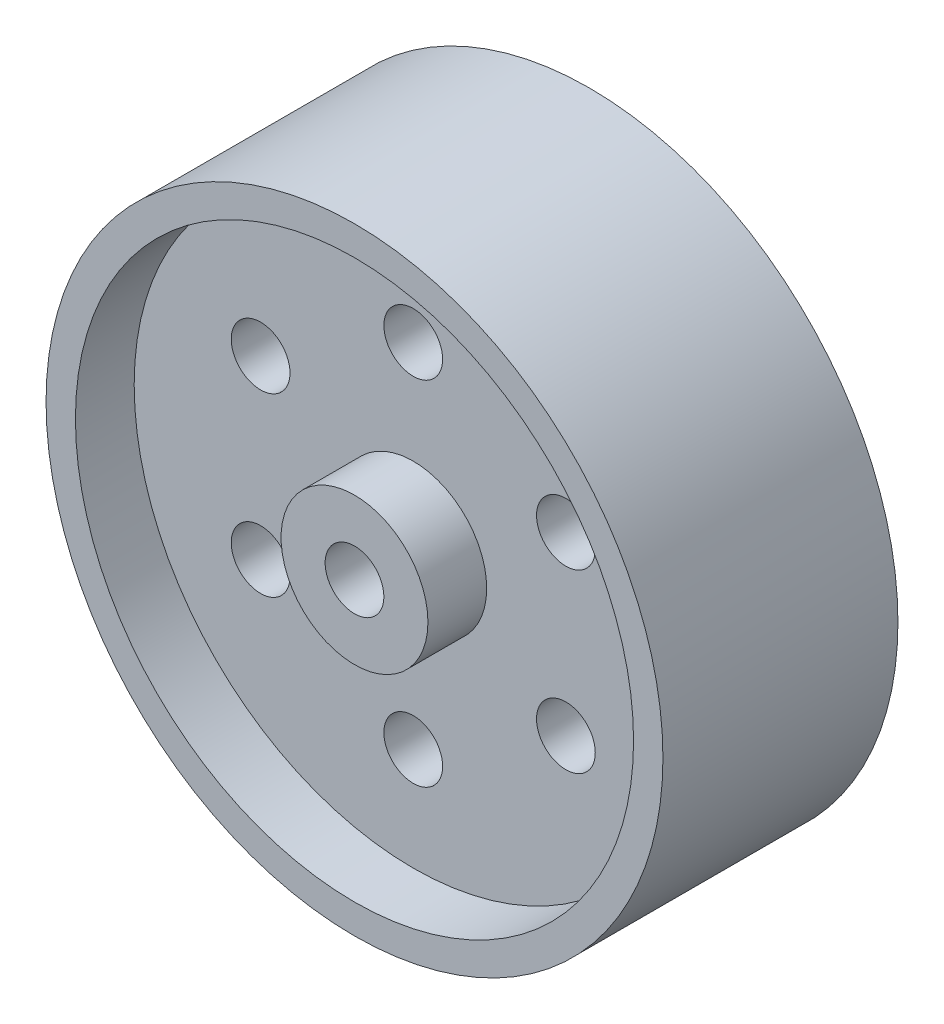
ISO-10303-21;
HEADER;
FILE_DESCRIPTION(('STEP AP214'),'2;1');
FILE_NAME('part.step','',(''),(''),'','','');
FILE_SCHEMA(('AUTOMOTIVE_DESIGN { 1 0 10303 214 1 1 1 1 }'));
ENDSEC;
DATA;
#1=APPLICATION_CONTEXT('core data for automotive mechanical design processes');
#2=APPLICATION_PROTOCOL_DEFINITION('international standard','automotive_design',2000,#1);
#3=PRODUCT_CONTEXT('',#1,'mechanical');
#4=PRODUCT('Part','Part','',(#3));
#5=PRODUCT_RELATED_PRODUCT_CATEGORY('part','',(#4));
#6=PRODUCT_DEFINITION_FORMATION('','',#4);
#7=PRODUCT_DEFINITION_CONTEXT('part definition',#1,'design');
#8=PRODUCT_DEFINITION('design','',#6,#7);
#9=PRODUCT_DEFINITION_SHAPE('','',#8);
#10=(LENGTH_UNIT() NAMED_UNIT(*) SI_UNIT(.MILLI.,.METRE.));
#11=(NAMED_UNIT(*) PLANE_ANGLE_UNIT() SI_UNIT($,.RADIAN.));
#12=(NAMED_UNIT(*) SI_UNIT($,.STERADIAN.) SOLID_ANGLE_UNIT());
#13=UNCERTAINTY_MEASURE_WITH_UNIT(LENGTH_MEASURE(1.E-05),#10,'distance_accuracy_value','');
#14=(GEOMETRIC_REPRESENTATION_CONTEXT(3) GLOBAL_UNCERTAINTY_ASSIGNED_CONTEXT((#13)) GLOBAL_UNIT_ASSIGNED_CONTEXT((#10,
#11,#12)) REPRESENTATION_CONTEXT('',''));
#15=CARTESIAN_POINT('',(0.,0.,0.));
#16=DIRECTION('',(0.,0.,1.));
#17=DIRECTION('',(1.,0.,0.));
#18=AXIS2_PLACEMENT_3D('',#15,#16,#17);
#19=CARTESIAN_POINT('',(0.,0.,-8.));
#20=DIRECTION('',(0.,0.,1.));
#21=DIRECTION('',(1.,0.,0.));
#22=AXIS2_PLACEMENT_3D('',#19,#20,#21);
#23=PLANE('',#22);
#24=CARTESIAN_POINT('',(0.,12.,-8.));
#25=DIRECTION('',(0.,0.,1.));
#26=DIRECTION('',(1.,0.,0.));
#27=AXIS2_PLACEMENT_3D('',#24,#25,#26);
#28=CIRCLE('',#27,2.);
#29=CARTESIAN_POINT('',(2.,12.,-8.));
#30=VERTEX_POINT('',#29);
#31=EDGE_CURVE('E45',#30,#30,#28,.T.);
#32=ORIENTED_EDGE('',*,*,#31,.T.);
#33=EDGE_LOOP('',(#32));
#34=FACE_BOUND('',#33,.T.);
#35=CARTESIAN_POINT('',(10.3923048454133,5.99999999999998,-8.));
#36=DIRECTION('',(0.,0.,1.));
#37=DIRECTION('',(1.,0.,0.));
#38=AXIS2_PLACEMENT_3D('',#35,#36,#37);
#39=CIRCLE('',#38,2.);
#40=CARTESIAN_POINT('',(12.3923048454133,5.99999999999998,-8.));
#41=VERTEX_POINT('',#40);
#42=EDGE_CURVE('E70',#41,#41,#39,.T.);
#43=ORIENTED_EDGE('',*,*,#42,.T.);
#44=EDGE_LOOP('',(#43));
#45=FACE_BOUND('',#44,.T.);
#46=CARTESIAN_POINT('',(10.3923048454133,-6.,-8.));
#47=DIRECTION('',(0.,0.,1.));
#48=DIRECTION('',(1.,0.,0.));
#49=AXIS2_PLACEMENT_3D('',#46,#47,#48);
#50=CIRCLE('',#49,2.00000000000006);
#51=CARTESIAN_POINT('',(12.3923048454133,-6.,-8.));
#52=VERTEX_POINT('',#51);
#53=EDGE_CURVE('E67',#52,#52,#50,.T.);
#54=ORIENTED_EDGE('',*,*,#53,.T.);
#55=EDGE_LOOP('',(#54));
#56=FACE_BOUND('',#55,.T.);
#57=CARTESIAN_POINT('',(0.,-12.,-8.));
#58=DIRECTION('',(0.,0.,1.));
#59=DIRECTION('',(1.,0.,0.));
#60=AXIS2_PLACEMENT_3D('',#57,#58,#59);
#61=CIRCLE('',#60,2.00000000000008);
#62=CARTESIAN_POINT('',(2.00000000000008,-12.,-8.));
#63=VERTEX_POINT('',#62);
#64=EDGE_CURVE('E64',#63,#63,#61,.T.);
#65=ORIENTED_EDGE('',*,*,#64,.T.);
#66=EDGE_LOOP('',(#65));
#67=FACE_BOUND('',#66,.T.);
#68=CARTESIAN_POINT('',(-10.3923048454133,-6.00000000000001,-8.));
#69=DIRECTION('',(0.,0.,1.));
#70=DIRECTION('',(1.,0.,0.));
#71=AXIS2_PLACEMENT_3D('',#68,#69,#70);
#72=CIRCLE('',#71,2.00000000000011);
#73=CARTESIAN_POINT('',(-8.39230484541315,-6.00000000000001,-8.));
#74=VERTEX_POINT('',#73);
#75=EDGE_CURVE('E60',#74,#74,#72,.T.);
#76=ORIENTED_EDGE('',*,*,#75,.T.);
#77=EDGE_LOOP('',(#76));
#78=FACE_BOUND('',#77,.T.);
#79=CARTESIAN_POINT('',(-10.3923048454129,5.99999999999941,-8.));
#80=DIRECTION('',(0.,0.,1.));
#81=DIRECTION('',(1.,0.,0.));
#82=AXIS2_PLACEMENT_3D('',#79,#80,#81);
#83=CIRCLE('',#82,2.00000000000064);
#84=CARTESIAN_POINT('',(-8.39230484541229,5.99999999999941,-8.));
#85=VERTEX_POINT('',#84);
#86=EDGE_CURVE('E57',#85,#85,#83,.T.);
#87=ORIENTED_EDGE('',*,*,#86,.T.);
#88=EDGE_LOOP('',(#87));
#89=FACE_BOUND('',#88,.T.);
#90=CARTESIAN_POINT('',(0.,0.,-8.));
#91=DIRECTION('',(0.,0.,1.));
#92=DIRECTION('',(1.,0.,0.));
#93=AXIS2_PLACEMENT_3D('',#90,#91,#92);
#94=CIRCLE('',#93,15.);
#95=CARTESIAN_POINT('',(15.,0.,-8.));
#96=VERTEX_POINT('',#95);
#97=EDGE_CURVE('E10',#96,#96,#94,.T.);
#98=ORIENTED_EDGE('',*,*,#97,.F.);
#99=EDGE_LOOP('',(#98));
#100=FACE_BOUND('',#99,.T.);
#101=CARTESIAN_POINT('',(0.,0.,-8.));
#102=DIRECTION('',(0.,0.,1.));
#103=DIRECTION('',(1.,0.,0.));
#104=AXIS2_PLACEMENT_3D('',#101,#102,#103);
#105=CIRCLE('',#104,2.);
#106=CARTESIAN_POINT('',(2.,0.,-8.));
#107=VERTEX_POINT('',#106);
#108=EDGE_CURVE('E156',#107,#107,#105,.F.);
#109=ORIENTED_EDGE('',*,*,#108,.F.);
#110=EDGE_LOOP('',(#109));
#111=FACE_BOUND('',#110,.T.);
#112=ADVANCED_FACE('F33',(#34,#45,#56,#67,#78,#89,#100,#111),#23,.F.);
#113=CARTESIAN_POINT('',(0.,12.,-8.));
#114=DIRECTION('',(0.,0.,1.));
#115=DIRECTION('',(1.,0.,0.));
#116=AXIS2_PLACEMENT_3D('',#113,#114,#115);
#117=CYLINDRICAL_SURFACE('',#116,2.);
#118=ORIENTED_EDGE('',*,*,#31,.F.);
#119=EDGE_LOOP('',(#118));
#120=FACE_BOUND('',#119,.T.);
#121=CARTESIAN_POINT('',(0.,12.,0.));
#122=DIRECTION('',(0.,0.,1.));
#123=DIRECTION('',(1.,0.,0.));
#124=AXIS2_PLACEMENT_3D('',#121,#122,#123);
#125=CIRCLE('',#124,2.);
#126=CARTESIAN_POINT('',(2.,12.,0.));
#127=VERTEX_POINT('',#126);
#128=EDGE_CURVE('E61',#127,#127,#125,.T.);
#129=ORIENTED_EDGE('',*,*,#128,.T.);
#130=EDGE_LOOP('',(#129));
#131=FACE_BOUND('',#130,.T.);
#132=ADVANCED_FACE('F91',(#120,#131),#117,.F.);
#133=CARTESIAN_POINT('',(10.3923048454133,5.99999999999998,-8.));
#134=DIRECTION('',(0.,0.,1.));
#135=DIRECTION('',(1.,0.,0.));
#136=AXIS2_PLACEMENT_3D('',#133,#134,#135);
#137=CYLINDRICAL_SURFACE('',#136,2.);
#138=ORIENTED_EDGE('',*,*,#42,.F.);
#139=EDGE_LOOP('',(#138));
#140=FACE_BOUND('',#139,.T.);
#141=CARTESIAN_POINT('',(10.3923048454133,5.99999999999998,0.));
#142=DIRECTION('',(0.,0.,1.));
#143=DIRECTION('',(1.,0.,0.));
#144=AXIS2_PLACEMENT_3D('',#141,#142,#143);
#145=CIRCLE('',#144,2.);
#146=CARTESIAN_POINT('',(12.3923048454133,5.99999999999998,0.));
#147=VERTEX_POINT('',#146);
#148=EDGE_CURVE('E86',#147,#147,#145,.T.);
#149=ORIENTED_EDGE('',*,*,#148,.T.);
#150=EDGE_LOOP('',(#149));
#151=FACE_BOUND('',#150,.T.);
#152=ADVANCED_FACE('F128',(#140,#151),#137,.F.);
#153=CARTESIAN_POINT('',(10.3923048454133,-6.,-8.));
#154=DIRECTION('',(0.,0.,1.));
#155=DIRECTION('',(1.,0.,0.));
#156=AXIS2_PLACEMENT_3D('',#153,#154,#155);
#157=CYLINDRICAL_SURFACE('',#156,2.00000000000006);
#158=ORIENTED_EDGE('',*,*,#53,.F.);
#159=EDGE_LOOP('',(#158));
#160=FACE_BOUND('',#159,.T.);
#161=CARTESIAN_POINT('',(10.3923048454133,-6.,0.));
#162=DIRECTION('',(0.,0.,1.));
#163=DIRECTION('',(1.,0.,0.));
#164=AXIS2_PLACEMENT_3D('',#161,#162,#163);
#165=CIRCLE('',#164,2.00000000000006);
#166=CARTESIAN_POINT('',(12.3923048454133,-6.,0.));
#167=VERTEX_POINT('',#166);
#168=EDGE_CURVE('E83',#167,#167,#165,.T.);
#169=ORIENTED_EDGE('',*,*,#168,.T.);
#170=EDGE_LOOP('',(#169));
#171=FACE_BOUND('',#170,.T.);
#172=ADVANCED_FACE('F137',(#160,#171),#157,.F.);
#173=CARTESIAN_POINT('',(0.,-12.,-8.));
#174=DIRECTION('',(0.,0.,1.));
#175=DIRECTION('',(1.,0.,0.));
#176=AXIS2_PLACEMENT_3D('',#173,#174,#175);
#177=CYLINDRICAL_SURFACE('',#176,2.00000000000008);
#178=ORIENTED_EDGE('',*,*,#64,.F.);
#179=EDGE_LOOP('',(#178));
#180=FACE_BOUND('',#179,.T.);
#181=CARTESIAN_POINT('',(0.,-12.,0.));
#182=DIRECTION('',(0.,0.,1.));
#183=DIRECTION('',(1.,0.,0.));
#184=AXIS2_PLACEMENT_3D('',#181,#182,#183);
#185=CIRCLE('',#184,2.00000000000008);
#186=CARTESIAN_POINT('',(2.00000000000008,-12.,0.));
#187=VERTEX_POINT('',#186);
#188=EDGE_CURVE('E80',#187,#187,#185,.T.);
#189=ORIENTED_EDGE('',*,*,#188,.T.);
#190=EDGE_LOOP('',(#189));
#191=FACE_BOUND('',#190,.T.);
#192=ADVANCED_FACE('F118',(#180,#191),#177,.F.);
#193=CARTESIAN_POINT('',(-10.3923048454133,-6.00000000000001,-8.));
#194=DIRECTION('',(0.,0.,1.));
#195=DIRECTION('',(1.,0.,0.));
#196=AXIS2_PLACEMENT_3D('',#193,#194,#195);
#197=CYLINDRICAL_SURFACE('',#196,2.00000000000011);
#198=ORIENTED_EDGE('',*,*,#75,.F.);
#199=EDGE_LOOP('',(#198));
#200=FACE_BOUND('',#199,.T.);
#201=CARTESIAN_POINT('',(-10.3923048454133,-6.00000000000001,0.));
#202=DIRECTION('',(0.,0.,1.));
#203=DIRECTION('',(1.,0.,0.));
#204=AXIS2_PLACEMENT_3D('',#201,#202,#203);
#205=CIRCLE('',#204,2.00000000000011);
#206=CARTESIAN_POINT('',(-8.39230484541315,-6.00000000000001,0.));
#207=VERTEX_POINT('',#206);
#208=EDGE_CURVE('E77',#207,#207,#205,.T.);
#209=ORIENTED_EDGE('',*,*,#208,.T.);
#210=EDGE_LOOP('',(#209));
#211=FACE_BOUND('',#210,.T.);
#212=ADVANCED_FACE('F111',(#200,#211),#197,.F.);
#213=CARTESIAN_POINT('',(-10.3923048454129,5.99999999999941,-8.));
#214=DIRECTION('',(0.,0.,1.));
#215=DIRECTION('',(1.,0.,0.));
#216=AXIS2_PLACEMENT_3D('',#213,#214,#215);
#217=CYLINDRICAL_SURFACE('',#216,2.00000000000064);
#218=ORIENTED_EDGE('',*,*,#86,.F.);
#219=EDGE_LOOP('',(#218));
#220=FACE_BOUND('',#219,.T.);
#221=CARTESIAN_POINT('',(-10.3923048454129,5.99999999999941,0.));
#222=DIRECTION('',(0.,0.,1.));
#223=DIRECTION('',(1.,0.,0.));
#224=AXIS2_PLACEMENT_3D('',#221,#222,#223);
#225=CIRCLE('',#224,2.00000000000064);
#226=CARTESIAN_POINT('',(-8.39230484541229,5.99999999999941,0.));
#227=VERTEX_POINT('',#226);
#228=EDGE_CURVE('E56',#227,#227,#225,.T.);
#229=ORIENTED_EDGE('',*,*,#228,.T.);
#230=EDGE_LOOP('',(#229));
#231=FACE_BOUND('',#230,.T.);
#232=ADVANCED_FACE('F109',(#220,#231),#217,.F.);
#233=CARTESIAN_POINT('',(0.,0.,-8.));
#234=DIRECTION('',(0.,0.,1.));
#235=DIRECTION('',(1.,0.,0.));
#236=AXIS2_PLACEMENT_3D('',#233,#234,#235);
#237=CYLINDRICAL_SURFACE('',#236,21.);
#238=CARTESIAN_POINT('',(0.,0.,4.));
#239=DIRECTION('',(0.,0.,1.));
#240=DIRECTION('',(1.,0.,0.));
#241=AXIS2_PLACEMENT_3D('',#238,#239,#240);
#242=CIRCLE('',#241,21.);
#243=CARTESIAN_POINT('',(21.,0.,4.));
#244=VERTEX_POINT('',#243);
#245=EDGE_CURVE('E53',#244,#244,#242,.T.);
#246=ORIENTED_EDGE('',*,*,#245,.F.);
#247=EDGE_LOOP('',(#246));
#248=FACE_BOUND('',#247,.T.);
#249=CARTESIAN_POINT('',(0.,0.,-12.));
#250=DIRECTION('',(0.,0.,1.));
#251=DIRECTION('',(1.,0.,0.));
#252=AXIS2_PLACEMENT_3D('',#249,#250,#251);
#253=CIRCLE('',#252,21.);
#254=CARTESIAN_POINT('',(21.,0.,-12.));
#255=VERTEX_POINT('',#254);
#256=EDGE_CURVE('E158',#255,#255,#253,.T.);
#257=ORIENTED_EDGE('',*,*,#256,.T.);
#258=EDGE_LOOP('',(#257));
#259=FACE_BOUND('',#258,.T.);
#260=ADVANCED_FACE('F35',(#248,#259),#237,.T.);
#261=CARTESIAN_POINT('',(0.,0.,0.));
#262=DIRECTION('',(0.,0.,1.));
#263=DIRECTION('',(1.,0.,0.));
#264=AXIS2_PLACEMENT_3D('',#261,#262,#263);
#265=PLANE('',#264);
#266=CARTESIAN_POINT('',(0.,0.,0.));
#267=DIRECTION('',(0.,0.,1.));
#268=DIRECTION('',(1.,0.,0.));
#269=AXIS2_PLACEMENT_3D('',#266,#267,#268);
#270=CIRCLE('',#269,5.);
#271=CARTESIAN_POINT('',(5.,0.,0.));
#272=VERTEX_POINT('',#271);
#273=EDGE_CURVE('E166',#272,#272,#270,.T.);
#274=ORIENTED_EDGE('',*,*,#273,.F.);
#275=EDGE_LOOP('',(#274));
#276=FACE_BOUND('',#275,.T.);
#277=CARTESIAN_POINT('',(0.,0.,0.));
#278=DIRECTION('',(0.,0.,1.));
#279=DIRECTION('',(1.,0.,0.));
#280=AXIS2_PLACEMENT_3D('',#277,#278,#279);
#281=CIRCLE('',#280,19.);
#282=CARTESIAN_POINT('',(19.,0.,0.));
#283=VERTEX_POINT('',#282);
#284=EDGE_CURVE('E37',#283,#283,#281,.F.);
#285=ORIENTED_EDGE('',*,*,#284,.F.);
#286=EDGE_LOOP('',(#285));
#287=FACE_BOUND('',#286,.T.);
#288=ORIENTED_EDGE('',*,*,#128,.F.);
#289=EDGE_LOOP('',(#288));
#290=FACE_BOUND('',#289,.T.);
#291=ORIENTED_EDGE('',*,*,#148,.F.);
#292=EDGE_LOOP('',(#291));
#293=FACE_BOUND('',#292,.T.);
#294=ORIENTED_EDGE('',*,*,#168,.F.);
#295=EDGE_LOOP('',(#294));
#296=FACE_BOUND('',#295,.T.);
#297=ORIENTED_EDGE('',*,*,#188,.F.);
#298=EDGE_LOOP('',(#297));
#299=FACE_BOUND('',#298,.T.);
#300=ORIENTED_EDGE('',*,*,#208,.F.);
#301=EDGE_LOOP('',(#300));
#302=FACE_BOUND('',#301,.T.);
#303=ORIENTED_EDGE('',*,*,#228,.F.);
#304=EDGE_LOOP('',(#303));
#305=FACE_BOUND('',#304,.T.);
#306=ADVANCED_FACE('F93',(#276,#287,#290,#293,#296,#299,#302,#305),#265,.T.);
#307=CARTESIAN_POINT('',(0.,0.,4.));
#308=DIRECTION('',(0.,0.,-1.));
#309=DIRECTION('',(-1.,0.,0.));
#310=AXIS2_PLACEMENT_3D('',#307,#308,#309);
#311=CYLINDRICAL_SURFACE('',#310,19.);
#312=CARTESIAN_POINT('',(0.,0.,4.));
#313=DIRECTION('',(0.,0.,1.));
#314=DIRECTION('',(1.,0.,0.));
#315=AXIS2_PLACEMENT_3D('',#312,#313,#314);
#316=CIRCLE('',#315,19.);
#317=CARTESIAN_POINT('',(19.,0.,4.));
#318=VERTEX_POINT('',#317);
#319=EDGE_CURVE('E50',#318,#318,#316,.T.);
#320=ORIENTED_EDGE('',*,*,#319,.T.);
#321=EDGE_LOOP('',(#320));
#322=FACE_BOUND('',#321,.T.);
#323=ORIENTED_EDGE('',*,*,#284,.T.);
#324=EDGE_LOOP('',(#323));
#325=FACE_BOUND('',#324,.T.);
#326=ADVANCED_FACE('F96',(#322,#325),#311,.F.);
#327=CARTESIAN_POINT('',(0.,0.,4.));
#328=DIRECTION('',(0.,0.,1.));
#329=DIRECTION('',(1.,0.,0.));
#330=AXIS2_PLACEMENT_3D('',#327,#328,#329);
#331=PLANE('',#330);
#332=ORIENTED_EDGE('',*,*,#319,.F.);
#333=EDGE_LOOP('',(#332));
#334=FACE_BOUND('',#333,.T.);
#335=ORIENTED_EDGE('',*,*,#245,.T.);
#336=EDGE_LOOP('',(#335));
#337=FACE_BOUND('',#336,.T.);
#338=ADVANCED_FACE('F189',(#334,#337),#331,.T.);
#339=CARTESIAN_POINT('',(0.,0.,-12.));
#340=DIRECTION('',(0.,0.,1.));
#341=DIRECTION('',(1.,0.,0.));
#342=AXIS2_PLACEMENT_3D('',#339,#340,#341);
#343=CYLINDRICAL_SURFACE('',#342,15.);
#344=CARTESIAN_POINT('',(0.,0.,-12.));
#345=DIRECTION('',(0.,0.,1.));
#346=DIRECTION('',(1.,0.,0.));
#347=AXIS2_PLACEMENT_3D('',#344,#345,#346);
#348=CIRCLE('',#347,15.);
#349=CARTESIAN_POINT('',(15.,0.,-12.));
#350=VERTEX_POINT('',#349);
#351=EDGE_CURVE('E48',#350,#350,#348,.T.);
#352=ORIENTED_EDGE('',*,*,#351,.F.);
#353=EDGE_LOOP('',(#352));
#354=FACE_BOUND('',#353,.T.);
#355=ORIENTED_EDGE('',*,*,#97,.T.);
#356=EDGE_LOOP('',(#355));
#357=FACE_BOUND('',#356,.T.);
#358=ADVANCED_FACE('F194',(#354,#357),#343,.F.);
#359=CARTESIAN_POINT('',(0.,0.,-12.));
#360=DIRECTION('',(0.,0.,1.));
#361=DIRECTION('',(1.,0.,0.));
#362=AXIS2_PLACEMENT_3D('',#359,#360,#361);
#363=PLANE('',#362);
#364=ORIENTED_EDGE('',*,*,#256,.F.);
#365=EDGE_LOOP('',(#364));
#366=FACE_BOUND('',#365,.T.);
#367=ORIENTED_EDGE('',*,*,#351,.T.);
#368=EDGE_LOOP('',(#367));
#369=FACE_BOUND('',#368,.T.);
#370=ADVANCED_FACE('F202',(#366,#369),#363,.F.);
#371=CARTESIAN_POINT('',(0.,0.,-22.1421356237309));
#372=DIRECTION('',(0.,0.,1.));
#373=DIRECTION('',(1.,0.,0.));
#374=AXIS2_PLACEMENT_3D('',#371,#372,#373);
#375=CYLINDRICAL_SURFACE('',#374,2.);
#376=ORIENTED_EDGE('',*,*,#108,.T.);
#377=EDGE_LOOP('',(#376));
#378=FACE_BOUND('',#377,.T.);
#379=CARTESIAN_POINT('',(0.,0.,4.));
#380=DIRECTION('',(0.,0.,1.));
#381=DIRECTION('',(1.,0.,0.));
#382=AXIS2_PLACEMENT_3D('',#379,#380,#381);
#383=CIRCLE('',#382,2.);
#384=CARTESIAN_POINT('',(2.,0.,4.));
#385=VERTEX_POINT('',#384);
#386=EDGE_CURVE('E163',#385,#385,#383,.T.);
#387=ORIENTED_EDGE('',*,*,#386,.T.);
#388=EDGE_LOOP('',(#387));
#389=FACE_BOUND('',#388,.T.);
#390=ADVANCED_FACE('F172',(#378,#389),#375,.F.);
#391=CARTESIAN_POINT('',(0.,0.,4.));
#392=DIRECTION('',(0.,0.,-1.));
#393=DIRECTION('',(-1.,0.,0.));
#394=AXIS2_PLACEMENT_3D('',#391,#392,#393);
#395=CYLINDRICAL_SURFACE('',#394,5.);
#396=CARTESIAN_POINT('',(0.,0.,4.));
#397=DIRECTION('',(0.,0.,1.));
#398=DIRECTION('',(1.,0.,0.));
#399=AXIS2_PLACEMENT_3D('',#396,#397,#398);
#400=CIRCLE('',#399,5.);
#401=CARTESIAN_POINT('',(5.,0.,4.));
#402=VERTEX_POINT('',#401);
#403=EDGE_CURVE('E159',#402,#402,#400,.T.);
#404=ORIENTED_EDGE('',*,*,#403,.F.);
#405=EDGE_LOOP('',(#404));
#406=FACE_BOUND('',#405,.T.);
#407=ORIENTED_EDGE('',*,*,#273,.T.);
#408=EDGE_LOOP('',(#407));
#409=FACE_BOUND('',#408,.T.);
#410=ADVANCED_FACE('F177',(#406,#409),#395,.T.);
#411=CARTESIAN_POINT('',(0.,0.,4.));
#412=DIRECTION('',(0.,0.,1.));
#413=DIRECTION('',(1.,0.,0.));
#414=AXIS2_PLACEMENT_3D('',#411,#412,#413);
#415=PLANE('',#414);
#416=ORIENTED_EDGE('',*,*,#386,.F.);
#417=EDGE_LOOP('',(#416));
#418=FACE_BOUND('',#417,.T.);
#419=ORIENTED_EDGE('',*,*,#403,.T.);
#420=EDGE_LOOP('',(#419));
#421=FACE_BOUND('',#420,.T.);
#422=ADVANCED_FACE('F174',(#418,#421),#415,.T.);
#423=CLOSED_SHELL('',(#112,#132,#152,#172,#192,#212,#232,#260,#306,#326,#338,#358,#370,#390,
#410,#422));
#424=MANIFOLD_SOLID_BREP('B2',#423);
#425=ADVANCED_BREP_SHAPE_REPRESENTATION('',(#18,#424),#14);
#426=SHAPE_DEFINITION_REPRESENTATION(#9,#425);
ENDSEC;
END-ISO-10303-21;
